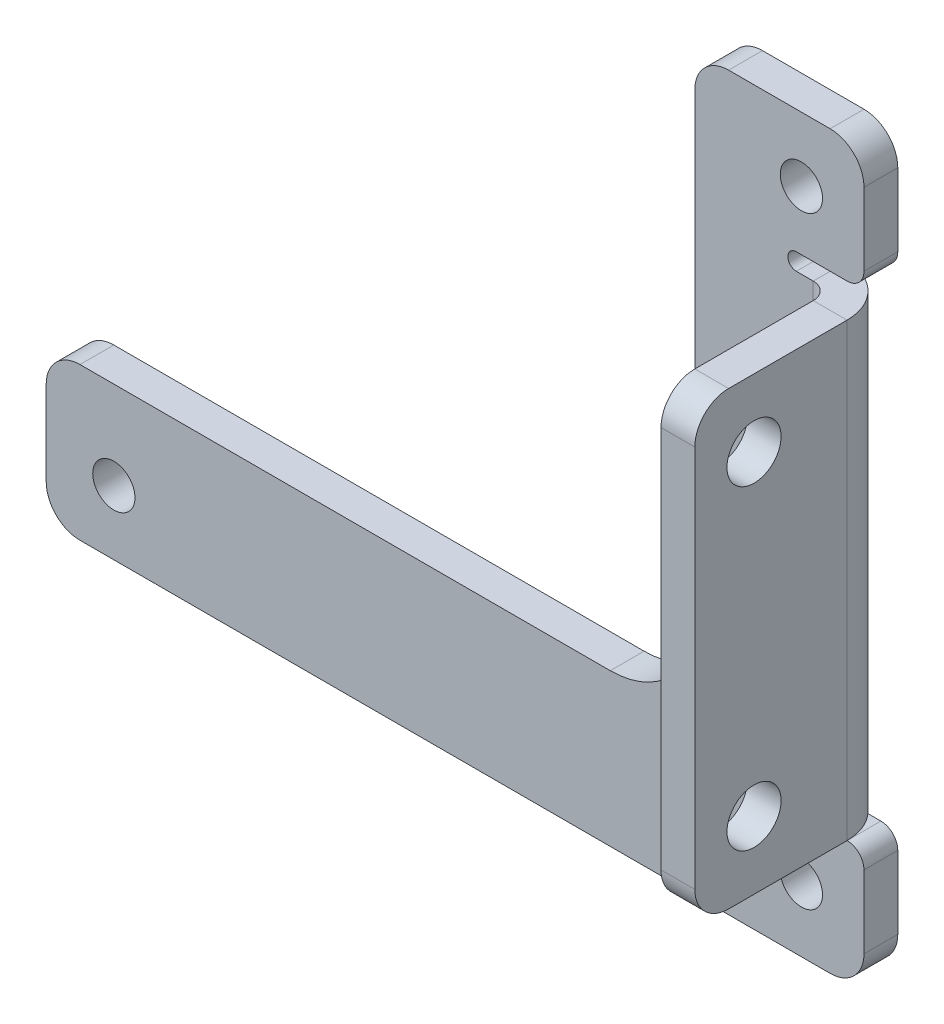
ISO-10303-21;
HEADER;
FILE_DESCRIPTION(('STEP AP214'),'2;1');
FILE_NAME('part.step','',(''),(''),'','','');
FILE_SCHEMA(('AUTOMOTIVE_DESIGN { 1 0 10303 214 1 1 1 1 }'));
ENDSEC;
DATA;
#1=APPLICATION_CONTEXT('core data for automotive mechanical design processes');
#2=APPLICATION_PROTOCOL_DEFINITION('international standard','automotive_design',2000,#1);
#3=PRODUCT_CONTEXT('',#1,'mechanical');
#4=PRODUCT('Part','Part','',(#3));
#5=PRODUCT_RELATED_PRODUCT_CATEGORY('part','',(#4));
#6=PRODUCT_DEFINITION_FORMATION('','',#4);
#7=PRODUCT_DEFINITION_CONTEXT('part definition',#1,'design');
#8=PRODUCT_DEFINITION('design','',#6,#7);
#9=PRODUCT_DEFINITION_SHAPE('','',#8);
#10=(LENGTH_UNIT() NAMED_UNIT(*) SI_UNIT(.MILLI.,.METRE.));
#11=(NAMED_UNIT(*) PLANE_ANGLE_UNIT() SI_UNIT($,.RADIAN.));
#12=(NAMED_UNIT(*) SI_UNIT($,.STERADIAN.) SOLID_ANGLE_UNIT());
#13=UNCERTAINTY_MEASURE_WITH_UNIT(LENGTH_MEASURE(1.E-05),#10,'distance_accuracy_value','');
#14=(GEOMETRIC_REPRESENTATION_CONTEXT(3) GLOBAL_UNCERTAINTY_ASSIGNED_CONTEXT((#13)) GLOBAL_UNIT_ASSIGNED_CONTEXT((#10,
#11,#12)) REPRESENTATION_CONTEXT('',''));
#15=CARTESIAN_POINT('',(0.,0.,0.));
#16=DIRECTION('',(0.,0.,1.));
#17=DIRECTION('',(1.,0.,0.));
#18=AXIS2_PLACEMENT_3D('',#15,#16,#17);
#19=CARTESIAN_POINT('',(48.35,0.,2.));
#20=DIRECTION('',(-1.,0.,0.));
#21=DIRECTION('',(0.,1.,0.));
#22=AXIS2_PLACEMENT_3D('',#19,#20,#21);
#23=PLANE('',#22);
#24=DIRECTION('',(0.,1.,0.));
#25=VECTOR('',#24,1.);
#26=CARTESIAN_POINT('',(48.35,0.,2.));
#27=LINE('',#26,#25);
#28=CARTESIAN_POINT('',(48.35,36.95,2.));
#29=VERTEX_POINT('',#28);
#30=CARTESIAN_POINT('',(48.35,41.25,2.));
#31=VERTEX_POINT('',#30);
#32=EDGE_CURVE('E357',#29,#31,#27,.T.);
#33=ORIENTED_EDGE('',*,*,#32,.F.);
#34=DIRECTION('',(0.,0.,-1.));
#35=VECTOR('',#34,1.);
#36=CARTESIAN_POINT('',(48.35,36.95,2.00000000000026));
#37=LINE('',#36,#35);
#38=CARTESIAN_POINT('',(48.35,36.95,0.));
#39=VERTEX_POINT('',#38);
#40=EDGE_CURVE('E82',#29,#39,#37,.T.);
#41=ORIENTED_EDGE('',*,*,#40,.T.);
#42=DIRECTION('',(0.,1.,0.));
#43=VECTOR('',#42,1.);
#44=CARTESIAN_POINT('',(48.35,0.,0.));
#45=LINE('',#44,#43);
#46=CARTESIAN_POINT('',(48.35,41.25,0.));
#47=VERTEX_POINT('',#46);
#48=EDGE_CURVE('E373',#39,#47,#45,.T.);
#49=ORIENTED_EDGE('',*,*,#48,.T.);
#50=DIRECTION('',(0.,0.,-1.));
#51=VECTOR('',#50,1.);
#52=CARTESIAN_POINT('',(48.35,41.25,2.));
#53=LINE('',#52,#51);
#54=EDGE_CURVE('E452',#47,#31,#53,.F.);
#55=ORIENTED_EDGE('',*,*,#54,.T.);
#56=EDGE_LOOP('',(#33,#41,#49,#55));
#57=FACE_BOUND('',#56,.T.);
#58=ADVANCED_FACE('F74',(#57),#23,.F.);
#59=CARTESIAN_POINT('',(48.35,2.00000000000001,0.));
#60=VERTEX_POINT('',#59);
#61=CARTESIAN_POINT('',(48.35,6.30000000000001,0.));
#62=VERTEX_POINT('',#61);
#63=EDGE_CURVE('E370',#60,#62,#45,.T.);
#64=ORIENTED_EDGE('',*,*,#63,.T.);
#65=DIRECTION('',(0.,0.,-1.));
#66=VECTOR('',#65,1.);
#67=CARTESIAN_POINT('',(48.35,6.3,2.00000000000004));
#68=LINE('',#67,#66);
#69=CARTESIAN_POINT('',(48.35,6.3,2.));
#70=VERTEX_POINT('',#69);
#71=EDGE_CURVE('E473',#62,#70,#68,.F.);
#72=ORIENTED_EDGE('',*,*,#71,.T.);
#73=CARTESIAN_POINT('',(48.35,2.00000000000001,2.));
#74=VERTEX_POINT('',#73);
#75=EDGE_CURVE('E358',#74,#70,#27,.T.);
#76=ORIENTED_EDGE('',*,*,#75,.F.);
#77=DIRECTION('',(0.,0.,-1.));
#78=VECTOR('',#77,1.);
#79=CARTESIAN_POINT('',(48.35,2.00000000000001,2.));
#80=LINE('',#79,#78);
#81=EDGE_CURVE('E455',#74,#60,#80,.T.);
#82=ORIENTED_EDGE('',*,*,#81,.T.);
#83=EDGE_LOOP('',(#64,#72,#76,#82));
#84=FACE_BOUND('',#83,.T.);
#85=ADVANCED_FACE('F605',(#84),#23,.F.);
#86=CARTESIAN_POINT('',(0.,0.,2.));
#87=DIRECTION('',(0.,0.,-1.));
#88=DIRECTION('',(-1.,0.,0.));
#89=AXIS2_PLACEMENT_3D('',#86,#87,#88);
#90=PLANE('',#89);
#91=CARTESIAN_POINT('',(44.65,39.45,2.));
#92=DIRECTION('',(0.,0.,-1.));
#93=DIRECTION('',(-1.,0.,0.));
#94=AXIS2_PLACEMENT_3D('',#91,#92,#93);
#95=CIRCLE('',#94,1.25);
#96=CARTESIAN_POINT('',(43.4,39.45,2.));
#97=VERTEX_POINT('',#96);
#98=EDGE_CURVE('E518',#97,#97,#95,.T.);
#99=ORIENTED_EDGE('',*,*,#98,.T.);
#100=EDGE_LOOP('',(#99));
#101=FACE_BOUND('',#100,.T.);
#102=CARTESIAN_POINT('',(3.99999999999998,3.8,2.));
#103=DIRECTION('',(0.,0.,-1.));
#104=DIRECTION('',(-1.,0.,0.));
#105=AXIS2_PLACEMENT_3D('',#102,#103,#104);
#106=CIRCLE('',#105,1.25);
#107=CARTESIAN_POINT('',(2.74999999999998,3.8,2.));
#108=VERTEX_POINT('',#107);
#109=EDGE_CURVE('E524',#108,#108,#106,.T.);
#110=ORIENTED_EDGE('',*,*,#109,.T.);
#111=EDGE_LOOP('',(#110));
#112=FACE_BOUND('',#111,.T.);
#113=CARTESIAN_POINT('',(44.65,3.8,2.));
#114=DIRECTION('',(0.,0.,-1.));
#115=DIRECTION('',(-1.,0.,0.));
#116=AXIS2_PLACEMENT_3D('',#113,#114,#115);
#117=CIRCLE('',#116,1.25);
#118=CARTESIAN_POINT('',(43.4,3.8,2.));
#119=VERTEX_POINT('',#118);
#120=EDGE_CURVE('E306',#119,#119,#117,.T.);
#121=ORIENTED_EDGE('',*,*,#120,.T.);
#122=EDGE_LOOP('',(#121));
#123=FACE_BOUND('',#122,.T.);
#124=ORIENTED_EDGE('',*,*,#75,.T.);
#125=CARTESIAN_POINT('',(47.35,6.3,2.));
#126=DIRECTION('',(0.,0.,-1.));
#127=DIRECTION('',(-1.,0.,0.));
#128=AXIS2_PLACEMENT_3D('',#125,#126,#127);
#129=CIRCLE('',#128,1.);
#130=CARTESIAN_POINT('',(47.35,7.3,2.));
#131=VERTEX_POINT('',#130);
#132=EDGE_CURVE('E476',#70,#131,#129,.F.);
#133=ORIENTED_EDGE('',*,*,#132,.T.);
#134=DIRECTION('',(1.,0.,0.));
#135=VECTOR('',#134,1.);
#136=CARTESIAN_POINT('',(44.35,7.3,2.));
#137=LINE('',#136,#135);
#138=CARTESIAN_POINT('',(44.35,7.3,2.));
#139=VERTEX_POINT('',#138);
#140=EDGE_CURVE('E339',#139,#131,#137,.T.);
#141=ORIENTED_EDGE('',*,*,#140,.F.);
#142=CARTESIAN_POINT('',(44.35,7.8,2.));
#143=DIRECTION('',(0.,0.,1.));
#144=DIRECTION('',(1.,0.,0.));
#145=AXIS2_PLACEMENT_3D('',#142,#143,#144);
#146=CIRCLE('',#145,0.5);
#147=CARTESIAN_POINT('',(44.35,8.3,2.));
#148=VERTEX_POINT('',#147);
#149=EDGE_CURVE('E335',#148,#139,#146,.T.);
#150=ORIENTED_EDGE('',*,*,#149,.F.);
#151=DIRECTION('',(-1.,0.,0.));
#152=VECTOR('',#151,1.);
#153=CARTESIAN_POINT('',(45.35,8.3,2.));
#154=LINE('',#153,#152);
#155=CARTESIAN_POINT('',(45.35,8.3,2.));
#156=VERTEX_POINT('',#155);
#157=EDGE_CURVE('E332',#156,#148,#154,.T.);
#158=ORIENTED_EDGE('',*,*,#157,.F.);
#159=DIRECTION('',(0.,1.,0.));
#160=VECTOR('',#159,1.);
#161=CARTESIAN_POINT('',(45.35,34.95,2.00000000000001));
#162=LINE('',#161,#160);
#163=CARTESIAN_POINT('',(45.35,34.95,2.00000000000001));
#164=VERTEX_POINT('',#163);
#165=EDGE_CURVE('E313',#164,#156,#162,.F.);
#166=ORIENTED_EDGE('',*,*,#165,.F.);
#167=DIRECTION('',(1.,0.,0.));
#168=VECTOR('',#167,1.);
#169=CARTESIAN_POINT('',(44.35,34.95,2.00000000000001));
#170=LINE('',#169,#168);
#171=CARTESIAN_POINT('',(44.35,34.95,2.00000000000001));
#172=VERTEX_POINT('',#171);
#173=EDGE_CURVE('E328',#172,#164,#170,.T.);
#174=ORIENTED_EDGE('',*,*,#173,.F.);
#175=CARTESIAN_POINT('',(44.35,35.45,2.00000000000001));
#176=DIRECTION('',(0.,0.,1.));
#177=DIRECTION('',(1.,0.,0.));
#178=AXIS2_PLACEMENT_3D('',#175,#176,#177);
#179=CIRCLE('',#178,0.5);
#180=CARTESIAN_POINT('',(44.35,35.95,2.00000000000001));
#181=VERTEX_POINT('',#180);
#182=EDGE_CURVE('E324',#181,#172,#179,.T.);
#183=ORIENTED_EDGE('',*,*,#182,.F.);
#184=DIRECTION('',(-1.,0.,0.));
#185=VECTOR('',#184,1.);
#186=CARTESIAN_POINT('',(48.35,35.95,2.));
#187=LINE('',#186,#185);
#188=CARTESIAN_POINT('',(47.35,35.95,2.));
#189=VERTEX_POINT('',#188);
#190=EDGE_CURVE('E321',#189,#181,#187,.T.);
#191=ORIENTED_EDGE('',*,*,#190,.F.);
#192=CARTESIAN_POINT('',(47.35,36.95,2.));
#193=DIRECTION('',(0.,0.,-1.));
#194=DIRECTION('',(-1.,0.,0.));
#195=AXIS2_PLACEMENT_3D('',#192,#193,#194);
#196=CIRCLE('',#195,1.);
#197=EDGE_CURVE('E89',#189,#29,#196,.F.);
#198=ORIENTED_EDGE('',*,*,#197,.T.);
#199=ORIENTED_EDGE('',*,*,#32,.T.);
#200=CARTESIAN_POINT('',(46.35,41.25,2.));
#201=DIRECTION('',(0.,0.,-1.));
#202=DIRECTION('',(-1.,0.,0.));
#203=AXIS2_PLACEMENT_3D('',#200,#201,#202);
#204=CIRCLE('',#203,2.);
#205=CARTESIAN_POINT('',(46.35,43.25,2.));
#206=VERTEX_POINT('',#205);
#207=EDGE_CURVE('E416',#31,#206,#204,.F.);
#208=ORIENTED_EDGE('',*,*,#207,.T.);
#209=DIRECTION('',(-1.,0.,0.));
#210=VECTOR('',#209,1.);
#211=CARTESIAN_POINT('',(0.,43.25,2.));
#212=LINE('',#211,#210);
#213=CARTESIAN_POINT('',(40.35,43.25,2.));
#214=VERTEX_POINT('',#213);
#215=EDGE_CURVE('E361',#206,#214,#212,.T.);
#216=ORIENTED_EDGE('',*,*,#215,.T.);
#217=CARTESIAN_POINT('',(40.35,41.25,2.));
#218=DIRECTION('',(0.,0.,-1.));
#219=DIRECTION('',(-1.,0.,0.));
#220=AXIS2_PLACEMENT_3D('',#217,#218,#219);
#221=CIRCLE('',#220,2.);
#222=CARTESIAN_POINT('',(38.35,41.25,2.));
#223=VERTEX_POINT('',#222);
#224=EDGE_CURVE('E422',#214,#223,#221,.F.);
#225=ORIENTED_EDGE('',*,*,#224,.T.);
#226=DIRECTION('',(0.,1.,0.));
#227=VECTOR('',#226,1.);
#228=CARTESIAN_POINT('',(38.35,9.,2.));
#229=LINE('',#228,#227);
#230=CARTESIAN_POINT('',(38.35,14.,2.));
#231=VERTEX_POINT('',#230);
#232=EDGE_CURVE('E502',#231,#223,#229,.T.);
#233=ORIENTED_EDGE('',*,*,#232,.F.);
#234=CARTESIAN_POINT('',(33.35,14.,2.));
#235=DIRECTION('',(0.,0.,-1.));
#236=DIRECTION('',(-1.,0.,0.));
#237=AXIS2_PLACEMENT_3D('',#234,#235,#236);
#238=CIRCLE('',#237,5.);
#239=CARTESIAN_POINT('',(33.35,9.,2.));
#240=VERTEX_POINT('',#239);
#241=EDGE_CURVE('E462',#231,#240,#238,.T.);
#242=ORIENTED_EDGE('',*,*,#241,.T.);
#243=DIRECTION('',(1.,0.,0.));
#244=VECTOR('',#243,1.);
#245=CARTESIAN_POINT('',(0.,9.,2.));
#246=LINE('',#245,#244);
#247=CARTESIAN_POINT('',(2.,9.,2.));
#248=VERTEX_POINT('',#247);
#249=EDGE_CURVE('E507',#248,#240,#246,.T.);
#250=ORIENTED_EDGE('',*,*,#249,.F.);
#251=CARTESIAN_POINT('',(2.,7.,2.));
#252=DIRECTION('',(0.,0.,-1.));
#253=DIRECTION('',(-1.,0.,0.));
#254=AXIS2_PLACEMENT_3D('',#251,#252,#253);
#255=CIRCLE('',#254,2.);
#256=CARTESIAN_POINT('',(0.,7.,2.));
#257=VERTEX_POINT('',#256);
#258=EDGE_CURVE('E420',#248,#257,#255,.F.);
#259=ORIENTED_EDGE('',*,*,#258,.T.);
#260=DIRECTION('',(0.,-1.,0.));
#261=VECTOR('',#260,1.);
#262=CARTESIAN_POINT('',(0.,0.,2.));
#263=LINE('',#262,#261);
#264=CARTESIAN_POINT('',(0.,2.,2.));
#265=VERTEX_POINT('',#264);
#266=EDGE_CURVE('E350',#257,#265,#263,.T.);
#267=ORIENTED_EDGE('',*,*,#266,.T.);
#268=CARTESIAN_POINT('',(2.,2.,2.));
#269=DIRECTION('',(0.,0.,-1.));
#270=DIRECTION('',(-1.,0.,0.));
#271=AXIS2_PLACEMENT_3D('',#268,#269,#270);
#272=CIRCLE('',#271,2.);
#273=CARTESIAN_POINT('',(2.,0.,2.));
#274=VERTEX_POINT('',#273);
#275=EDGE_CURVE('E418',#265,#274,#272,.F.);
#276=ORIENTED_EDGE('',*,*,#275,.T.);
#277=DIRECTION('',(1.,0.,0.));
#278=VECTOR('',#277,1.);
#279=CARTESIAN_POINT('',(0.,0.,2.));
#280=LINE('',#279,#278);
#281=CARTESIAN_POINT('',(46.35,0.,2.));
#282=VERTEX_POINT('',#281);
#283=EDGE_CURVE('E353',#274,#282,#280,.T.);
#284=ORIENTED_EDGE('',*,*,#283,.T.);
#285=CARTESIAN_POINT('',(46.35,2.00000000000001,2.));
#286=DIRECTION('',(0.,0.,-1.));
#287=DIRECTION('',(-1.,0.,0.));
#288=AXIS2_PLACEMENT_3D('',#285,#286,#287);
#289=CIRCLE('',#288,2.);
#290=EDGE_CURVE('E414',#282,#74,#289,.F.);
#291=ORIENTED_EDGE('',*,*,#290,.T.);
#292=EDGE_LOOP('',(#124,#133,#141,#150,#158,#166,#174,#183,#191,#198,#199,#208,#216,#225,#233,
#242,#250,#259,#267,#276,#284,#291));
#293=FACE_BOUND('',#292,.T.);
#294=ADVANCED_FACE('F493',(#101,#112,#123,#293),#90,.F.);
#295=CARTESIAN_POINT('',(0.,0.,0.));
#296=DIRECTION('',(0.,0.,-1.));
#297=DIRECTION('',(-1.,0.,0.));
#298=AXIS2_PLACEMENT_3D('',#295,#296,#297);
#299=PLANE('',#298);
#300=DIRECTION('',(1.,0.,0.));
#301=VECTOR('',#300,1.);
#302=CARTESIAN_POINT('',(0.,7.30000000000003,0.));
#303=LINE('',#302,#301);
#304=CARTESIAN_POINT('',(44.35,7.30000000000001,0.));
#305=VERTEX_POINT('',#304);
#306=CARTESIAN_POINT('',(47.35,7.30000000000001,0.));
#307=VERTEX_POINT('',#306);
#308=EDGE_CURVE('E364',#305,#307,#303,.T.);
#309=ORIENTED_EDGE('',*,*,#308,.T.);
#310=CARTESIAN_POINT('',(47.35,6.30000000000001,0.));
#311=DIRECTION('',(0.,0.,-1.));
#312=DIRECTION('',(-1.,0.,0.));
#313=AXIS2_PLACEMENT_3D('',#310,#311,#312);
#314=CIRCLE('',#313,1.);
#315=EDGE_CURVE('E471',#307,#62,#314,.T.);
#316=ORIENTED_EDGE('',*,*,#315,.T.);
#317=ORIENTED_EDGE('',*,*,#63,.F.);
#318=CARTESIAN_POINT('',(46.35,2.00000000000001,0.));
#319=DIRECTION('',(0.,0.,-1.));
#320=DIRECTION('',(-1.,0.,0.));
#321=AXIS2_PLACEMENT_3D('',#318,#319,#320);
#322=CIRCLE('',#321,2.);
#323=CARTESIAN_POINT('',(46.35,0.,0.));
#324=VERTEX_POINT('',#323);
#325=EDGE_CURVE('E428',#60,#324,#322,.T.);
#326=ORIENTED_EDGE('',*,*,#325,.T.);
#327=DIRECTION('',(-1.,0.,0.));
#328=VECTOR('',#327,1.);
#329=CARTESIAN_POINT('',(0.,0.,0.));
#330=LINE('',#329,#328);
#331=CARTESIAN_POINT('',(2.,0.,0.));
#332=VERTEX_POINT('',#331);
#333=EDGE_CURVE('E367',#332,#324,#330,.F.);
#334=ORIENTED_EDGE('',*,*,#333,.F.);
#335=CARTESIAN_POINT('',(2.,2.,0.));
#336=DIRECTION('',(0.,0.,-1.));
#337=DIRECTION('',(-1.,0.,0.));
#338=AXIS2_PLACEMENT_3D('',#335,#336,#337);
#339=CIRCLE('',#338,2.);
#340=CARTESIAN_POINT('',(0.,2.,0.));
#341=VERTEX_POINT('',#340);
#342=EDGE_CURVE('E433',#332,#341,#339,.T.);
#343=ORIENTED_EDGE('',*,*,#342,.T.);
#344=DIRECTION('',(0.,1.,0.));
#345=VECTOR('',#344,1.);
#346=CARTESIAN_POINT('',(0.,0.,0.));
#347=LINE('',#346,#345);
#348=CARTESIAN_POINT('',(0.,7.,0.));
#349=VERTEX_POINT('',#348);
#350=EDGE_CURVE('E323',#349,#341,#347,.F.);
#351=ORIENTED_EDGE('',*,*,#350,.F.);
#352=CARTESIAN_POINT('',(2.,7.,0.));
#353=DIRECTION('',(0.,0.,-1.));
#354=DIRECTION('',(-1.,0.,0.));
#355=AXIS2_PLACEMENT_3D('',#352,#353,#354);
#356=CIRCLE('',#355,2.);
#357=CARTESIAN_POINT('',(2.,9.,0.));
#358=VERTEX_POINT('',#357);
#359=EDGE_CURVE('E435',#349,#358,#356,.T.);
#360=ORIENTED_EDGE('',*,*,#359,.T.);
#361=DIRECTION('',(1.,0.,0.));
#362=VECTOR('',#361,1.);
#363=CARTESIAN_POINT('',(0.,9.,0.));
#364=LINE('',#363,#362);
#365=CARTESIAN_POINT('',(33.35,9.,0.));
#366=VERTEX_POINT('',#365);
#367=EDGE_CURVE('E506',#358,#366,#364,.T.);
#368=ORIENTED_EDGE('',*,*,#367,.T.);
#369=CARTESIAN_POINT('',(33.35,14.,0.));
#370=DIRECTION('',(0.,0.,-1.));
#371=DIRECTION('',(-1.,0.,0.));
#372=AXIS2_PLACEMENT_3D('',#369,#370,#371);
#373=CIRCLE('',#372,5.);
#374=CARTESIAN_POINT('',(38.35,14.,0.));
#375=VERTEX_POINT('',#374);
#376=EDGE_CURVE('E464',#366,#375,#373,.F.);
#377=ORIENTED_EDGE('',*,*,#376,.T.);
#378=DIRECTION('',(0.,1.,0.));
#379=VECTOR('',#378,1.);
#380=CARTESIAN_POINT('',(38.35,9.,0.));
#381=LINE('',#380,#379);
#382=CARTESIAN_POINT('',(38.35,41.25,0.));
#383=VERTEX_POINT('',#382);
#384=EDGE_CURVE('E510',#375,#383,#381,.T.);
#385=ORIENTED_EDGE('',*,*,#384,.T.);
#386=CARTESIAN_POINT('',(40.35,41.25,0.));
#387=DIRECTION('',(0.,0.,-1.));
#388=DIRECTION('',(-1.,0.,0.));
#389=AXIS2_PLACEMENT_3D('',#386,#387,#388);
#390=CIRCLE('',#389,2.);
#391=CARTESIAN_POINT('',(40.35,43.25,0.));
#392=VERTEX_POINT('',#391);
#393=EDGE_CURVE('E437',#383,#392,#390,.T.);
#394=ORIENTED_EDGE('',*,*,#393,.T.);
#395=DIRECTION('',(-1.,0.,0.));
#396=VECTOR('',#395,1.);
#397=CARTESIAN_POINT('',(0.,43.25,0.));
#398=LINE('',#397,#396);
#399=CARTESIAN_POINT('',(46.35,43.25,0.));
#400=VERTEX_POINT('',#399);
#401=EDGE_CURVE('E354',#400,#392,#398,.T.);
#402=ORIENTED_EDGE('',*,*,#401,.F.);
#403=CARTESIAN_POINT('',(46.35,41.25,0.));
#404=DIRECTION('',(0.,0.,-1.));
#405=DIRECTION('',(-1.,0.,0.));
#406=AXIS2_PLACEMENT_3D('',#403,#404,#405);
#407=CIRCLE('',#406,2.);
#408=EDGE_CURVE('E430',#400,#47,#407,.T.);
#409=ORIENTED_EDGE('',*,*,#408,.T.);
#410=ORIENTED_EDGE('',*,*,#48,.F.);
#411=CARTESIAN_POINT('',(47.35,36.95,0.));
#412=DIRECTION('',(0.,0.,-1.));
#413=DIRECTION('',(-1.,0.,0.));
#414=AXIS2_PLACEMENT_3D('',#411,#412,#413);
#415=CIRCLE('',#414,1.);
#416=CARTESIAN_POINT('',(47.35,35.95,0.));
#417=VERTEX_POINT('',#416);
#418=EDGE_CURVE('E469',#39,#417,#415,.T.);
#419=ORIENTED_EDGE('',*,*,#418,.T.);
#420=DIRECTION('',(-1.,0.,0.));
#421=VECTOR('',#420,1.);
#422=CARTESIAN_POINT('',(0.,35.95,0.));
#423=LINE('',#422,#421);
#424=CARTESIAN_POINT('',(44.35,35.95,0.));
#425=VERTEX_POINT('',#424);
#426=EDGE_CURVE('E390',#417,#425,#423,.T.);
#427=ORIENTED_EDGE('',*,*,#426,.T.);
#428=CARTESIAN_POINT('',(44.35,35.45,0.));
#429=DIRECTION('',(0.,0.,-1.));
#430=DIRECTION('',(-1.,0.,0.));
#431=AXIS2_PLACEMENT_3D('',#428,#429,#430);
#432=CIRCLE('',#431,0.5);
#433=CARTESIAN_POINT('',(44.35,34.95,0.));
#434=VERTEX_POINT('',#433);
#435=EDGE_CURVE('E387',#425,#434,#432,.F.);
#436=ORIENTED_EDGE('',*,*,#435,.T.);
#437=DIRECTION('',(1.,0.,0.));
#438=VECTOR('',#437,1.);
#439=CARTESIAN_POINT('',(0.,34.95,0.));
#440=LINE('',#439,#438);
#441=CARTESIAN_POINT('',(45.35,34.95,0.));
#442=VERTEX_POINT('',#441);
#443=EDGE_CURVE('E384',#434,#442,#440,.T.);
#444=ORIENTED_EDGE('',*,*,#443,.T.);
#445=DIRECTION('',(0.,1.,0.));
#446=VECTOR('',#445,1.);
#447=CARTESIAN_POINT('',(45.35,34.95,0.));
#448=LINE('',#447,#446);
#449=CARTESIAN_POINT('',(45.35,8.30000000000001,0.));
#450=VERTEX_POINT('',#449);
#451=EDGE_CURVE('E265',#442,#450,#448,.F.);
#452=ORIENTED_EDGE('',*,*,#451,.T.);
#453=DIRECTION('',(-1.,0.,0.));
#454=VECTOR('',#453,1.);
#455=CARTESIAN_POINT('',(0.,8.30000000000001,0.));
#456=LINE('',#455,#454);
#457=CARTESIAN_POINT('',(44.35,8.30000000000001,0.));
#458=VERTEX_POINT('',#457);
#459=EDGE_CURVE('E381',#450,#458,#456,.T.);
#460=ORIENTED_EDGE('',*,*,#459,.T.);
#461=CARTESIAN_POINT('',(44.35,7.80000000000001,0.));
#462=DIRECTION('',(0.,0.,-1.));
#463=DIRECTION('',(-1.,0.,0.));
#464=AXIS2_PLACEMENT_3D('',#461,#462,#463);
#465=CIRCLE('',#464,0.5);
#466=EDGE_CURVE('E378',#458,#305,#465,.F.);
#467=ORIENTED_EDGE('',*,*,#466,.T.);
#468=EDGE_LOOP('',(#309,#316,#317,#326,#334,#343,#351,#360,#368,#377,#385,#394,#402,#409,#410,
#419,#427,#436,#444,#452,#460,#467));
#469=FACE_BOUND('',#468,.T.);
#470=CARTESIAN_POINT('',(44.65,39.45,0.));
#471=DIRECTION('',(0.,0.,-1.));
#472=DIRECTION('',(-1.,0.,0.));
#473=AXIS2_PLACEMENT_3D('',#470,#471,#472);
#474=CIRCLE('',#473,1.25);
#475=CARTESIAN_POINT('',(43.4,39.45,0.));
#476=VERTEX_POINT('',#475);
#477=EDGE_CURVE('E515',#476,#476,#474,.T.);
#478=ORIENTED_EDGE('',*,*,#477,.F.);
#479=EDGE_LOOP('',(#478));
#480=FACE_BOUND('',#479,.T.);
#481=CARTESIAN_POINT('',(3.99999999999998,3.8,0.));
#482=DIRECTION('',(0.,0.,-1.));
#483=DIRECTION('',(-1.,0.,0.));
#484=AXIS2_PLACEMENT_3D('',#481,#482,#483);
#485=CIRCLE('',#484,1.25);
#486=CARTESIAN_POINT('',(2.74999999999998,3.8,0.));
#487=VERTEX_POINT('',#486);
#488=EDGE_CURVE('E521',#487,#487,#485,.T.);
#489=ORIENTED_EDGE('',*,*,#488,.F.);
#490=EDGE_LOOP('',(#489));
#491=FACE_BOUND('',#490,.T.);
#492=CARTESIAN_POINT('',(44.65,3.8,0.));
#493=DIRECTION('',(0.,0.,-1.));
#494=DIRECTION('',(-1.,0.,0.));
#495=AXIS2_PLACEMENT_3D('',#492,#493,#494);
#496=CIRCLE('',#495,1.25);
#497=CARTESIAN_POINT('',(43.4,3.8,0.));
#498=VERTEX_POINT('',#497);
#499=EDGE_CURVE('E527',#498,#498,#496,.T.);
#500=ORIENTED_EDGE('',*,*,#499,.F.);
#501=EDGE_LOOP('',(#500));
#502=FACE_BOUND('',#501,.T.);
#503=ADVANCED_FACE('F483',(#469,#480,#491,#502),#299,.T.);
#504=CARTESIAN_POINT('',(0.,43.25,2.));
#505=DIRECTION('',(0.,-1.,0.));
#506=DIRECTION('',(-1.,0.,0.));
#507=AXIS2_PLACEMENT_3D('',#504,#505,#506);
#508=PLANE('',#507);
#509=ORIENTED_EDGE('',*,*,#401,.T.);
#510=DIRECTION('',(0.,0.,1.));
#511=VECTOR('',#510,1.);
#512=CARTESIAN_POINT('',(40.35,43.25,2.));
#513=LINE('',#512,#511);
#514=EDGE_CURVE('E411',#392,#214,#513,.T.);
#515=ORIENTED_EDGE('',*,*,#514,.T.);
#516=ORIENTED_EDGE('',*,*,#215,.F.);
#517=DIRECTION('',(0.,0.,-1.));
#518=VECTOR('',#517,1.);
#519=CARTESIAN_POINT('',(46.35,43.25,2.));
#520=LINE('',#519,#518);
#521=EDGE_CURVE('E409',#206,#400,#520,.T.);
#522=ORIENTED_EDGE('',*,*,#521,.T.);
#523=EDGE_LOOP('',(#509,#515,#516,#522));
#524=FACE_BOUND('',#523,.T.);
#525=ADVANCED_FACE('F495',(#524),#508,.F.);
#526=CARTESIAN_POINT('',(0.,0.,2.));
#527=DIRECTION('',(1.,0.,0.));
#528=DIRECTION('',(0.,-1.,0.));
#529=AXIS2_PLACEMENT_3D('',#526,#527,#528);
#530=PLANE('',#529);
#531=ORIENTED_EDGE('',*,*,#266,.F.);
#532=DIRECTION('',(0.,0.,1.));
#533=VECTOR('',#532,1.);
#534=CARTESIAN_POINT('',(0.,7.,0.));
#535=LINE('',#534,#533);
#536=EDGE_CURVE('E445',#257,#349,#535,.F.);
#537=ORIENTED_EDGE('',*,*,#536,.T.);
#538=ORIENTED_EDGE('',*,*,#350,.T.);
#539=DIRECTION('',(0.,0.,-1.));
#540=VECTOR('',#539,1.);
#541=CARTESIAN_POINT('',(0.,2.,2.));
#542=LINE('',#541,#540);
#543=EDGE_CURVE('E442',#341,#265,#542,.F.);
#544=ORIENTED_EDGE('',*,*,#543,.T.);
#545=EDGE_LOOP('',(#531,#537,#538,#544));
#546=FACE_BOUND('',#545,.T.);
#547=ADVANCED_FACE('F618',(#546),#530,.F.);
#548=CARTESIAN_POINT('',(0.,0.,2.));
#549=DIRECTION('',(0.,1.,0.));
#550=DIRECTION('',(1.,0.,0.));
#551=AXIS2_PLACEMENT_3D('',#548,#549,#550);
#552=PLANE('',#551);
#553=ORIENTED_EDGE('',*,*,#283,.F.);
#554=DIRECTION('',(0.,0.,-1.));
#555=VECTOR('',#554,1.);
#556=CARTESIAN_POINT('',(2.,0.,2.));
#557=LINE('',#556,#555);
#558=EDGE_CURVE('E450',#274,#332,#557,.T.);
#559=ORIENTED_EDGE('',*,*,#558,.T.);
#560=ORIENTED_EDGE('',*,*,#333,.T.);
#561=DIRECTION('',(0.,0.,-1.));
#562=VECTOR('',#561,1.);
#563=CARTESIAN_POINT('',(46.35,0.,2.));
#564=LINE('',#563,#562);
#565=EDGE_CURVE('E447',#324,#282,#564,.F.);
#566=ORIENTED_EDGE('',*,*,#565,.T.);
#567=EDGE_LOOP('',(#553,#559,#560,#566));
#568=FACE_BOUND('',#567,.T.);
#569=ADVANCED_FACE('F614',(#568),#552,.F.);
#570=CARTESIAN_POINT('',(48.35,35.95,2.));
#571=DIRECTION('',(0.,-1.,0.));
#572=DIRECTION('',(0.,0.,-1.));
#573=AXIS2_PLACEMENT_3D('',#570,#571,#572);
#574=PLANE('',#573);
#575=ORIENTED_EDGE('',*,*,#426,.F.);
#576=DIRECTION('',(0.,0.,1.));
#577=VECTOR('',#576,1.);
#578=CARTESIAN_POINT('',(47.35,35.95,2.));
#579=LINE('',#578,#577);
#580=EDGE_CURVE('E15',#417,#189,#579,.T.);
#581=ORIENTED_EDGE('',*,*,#580,.T.);
#582=ORIENTED_EDGE('',*,*,#190,.T.);
#583=DIRECTION('',(0.,0.,-1.));
#584=VECTOR('',#583,1.);
#585=CARTESIAN_POINT('',(44.35,35.95,2.00000000000001));
#586=LINE('',#585,#584);
#587=EDGE_CURVE('E327',#181,#425,#586,.T.);
#588=ORIENTED_EDGE('',*,*,#587,.T.);
#589=EDGE_LOOP('',(#575,#581,#582,#588));
#590=FACE_BOUND('',#589,.T.);
#591=ADVANCED_FACE('F617',(#590),#574,.T.);
#592=CARTESIAN_POINT('',(44.35,35.45,2.00000000000001));
#593=DIRECTION('',(0.,0.,-1.));
#594=DIRECTION('',(0.,1.,0.));
#595=AXIS2_PLACEMENT_3D('',#592,#593,#594);
#596=CYLINDRICAL_SURFACE('',#595,0.5);
#597=ORIENTED_EDGE('',*,*,#435,.F.);
#598=ORIENTED_EDGE('',*,*,#587,.F.);
#599=ORIENTED_EDGE('',*,*,#182,.T.);
#600=DIRECTION('',(0.,0.,-1.));
#601=VECTOR('',#600,1.);
#602=CARTESIAN_POINT('',(44.35,34.95,2.00000000000001));
#603=LINE('',#602,#601);
#604=EDGE_CURVE('E331',#172,#434,#603,.T.);
#605=ORIENTED_EDGE('',*,*,#604,.T.);
#606=EDGE_LOOP('',(#597,#598,#599,#605));
#607=FACE_BOUND('',#606,.T.);
#608=ADVANCED_FACE('F595',(#607),#596,.F.);
#609=CARTESIAN_POINT('',(44.35,34.95,2.00000000000001));
#610=DIRECTION('',(0.,1.,0.));
#611=DIRECTION('',(0.,0.,1.));
#612=AXIS2_PLACEMENT_3D('',#609,#610,#611);
#613=PLANE('',#612);
#614=ORIENTED_EDGE('',*,*,#443,.F.);
#615=ORIENTED_EDGE('',*,*,#604,.F.);
#616=ORIENTED_EDGE('',*,*,#173,.T.);
#617=DIRECTION('',(0.,0.,-1.));
#618=VECTOR('',#617,1.);
#619=CARTESIAN_POINT('',(45.35,34.95,2.00000000000001));
#620=LINE('',#619,#618);
#621=EDGE_CURVE('E309',#164,#442,#620,.T.);
#622=ORIENTED_EDGE('',*,*,#621,.T.);
#623=EDGE_LOOP('',(#614,#615,#616,#622));
#624=FACE_BOUND('',#623,.T.);
#625=ADVANCED_FACE('F593',(#624),#613,.T.);
#626=CARTESIAN_POINT('',(45.35,8.3,2.));
#627=DIRECTION('',(0.,-1.,0.));
#628=DIRECTION('',(0.,0.,-1.));
#629=AXIS2_PLACEMENT_3D('',#626,#627,#628);
#630=PLANE('',#629);
#631=ORIENTED_EDGE('',*,*,#459,.F.);
#632=DIRECTION('',(0.,0.,-1.));
#633=VECTOR('',#632,1.);
#634=CARTESIAN_POINT('',(45.35,8.3,2.));
#635=LINE('',#634,#633);
#636=EDGE_CURVE('E316',#156,#450,#635,.T.);
#637=ORIENTED_EDGE('',*,*,#636,.F.);
#638=ORIENTED_EDGE('',*,*,#157,.T.);
#639=DIRECTION('',(0.,0.,-1.));
#640=VECTOR('',#639,1.);
#641=CARTESIAN_POINT('',(44.35,8.3,2.));
#642=LINE('',#641,#640);
#643=EDGE_CURVE('E338',#148,#458,#642,.T.);
#644=ORIENTED_EDGE('',*,*,#643,.T.);
#645=EDGE_LOOP('',(#631,#637,#638,#644));
#646=FACE_BOUND('',#645,.T.);
#647=ADVANCED_FACE('F590',(#646),#630,.T.);
#648=CARTESIAN_POINT('',(44.35,7.8,2.));
#649=DIRECTION('',(0.,0.,-1.));
#650=DIRECTION('',(0.,1.,0.));
#651=AXIS2_PLACEMENT_3D('',#648,#649,#650);
#652=CYLINDRICAL_SURFACE('',#651,0.5);
#653=ORIENTED_EDGE('',*,*,#466,.F.);
#654=ORIENTED_EDGE('',*,*,#643,.F.);
#655=ORIENTED_EDGE('',*,*,#149,.T.);
#656=DIRECTION('',(0.,0.,-1.));
#657=VECTOR('',#656,1.);
#658=CARTESIAN_POINT('',(44.35,7.3,2.));
#659=LINE('',#658,#657);
#660=EDGE_CURVE('E319',#139,#305,#659,.T.);
#661=ORIENTED_EDGE('',*,*,#660,.T.);
#662=EDGE_LOOP('',(#653,#654,#655,#661));
#663=FACE_BOUND('',#662,.T.);
#664=ADVANCED_FACE('F695',(#663),#652,.F.);
#665=CARTESIAN_POINT('',(44.35,7.3,2.));
#666=DIRECTION('',(0.,1.,0.));
#667=DIRECTION('',(0.,0.,1.));
#668=AXIS2_PLACEMENT_3D('',#665,#666,#667);
#669=PLANE('',#668);
#670=ORIENTED_EDGE('',*,*,#140,.T.);
#671=DIRECTION('',(0.,0.,1.));
#672=VECTOR('',#671,1.);
#673=CARTESIAN_POINT('',(47.35,7.3,2.));
#674=LINE('',#673,#672);
#675=EDGE_CURVE('E466',#131,#307,#674,.F.);
#676=ORIENTED_EDGE('',*,*,#675,.T.);
#677=ORIENTED_EDGE('',*,*,#308,.F.);
#678=ORIENTED_EDGE('',*,*,#660,.F.);
#679=EDGE_LOOP('',(#670,#676,#677,#678));
#680=FACE_BOUND('',#679,.T.);
#681=ADVANCED_FACE('F690',(#680),#669,.T.);
#682=CARTESIAN_POINT('',(45.35,8.3,3.));
#683=DIRECTION('',(0.,-1.,0.));
#684=DIRECTION('',(0.,0.,-1.));
#685=AXIS2_PLACEMENT_3D('',#682,#683,#684);
#686=PLANE('',#685);
#687=DIRECTION('',(-1.,0.,0.));
#688=VECTOR('',#687,1.);
#689=CARTESIAN_POINT('',(48.35,8.3,2.99999999999999));
#690=LINE('',#689,#688);
#691=CARTESIAN_POINT('',(46.35,8.3,2.99999999999999));
#692=VERTEX_POINT('',#691);
#693=CARTESIAN_POINT('',(48.35,8.3,2.99999999999999));
#694=VERTEX_POINT('',#693);
#695=EDGE_CURVE('E303',#692,#694,#690,.F.);
#696=ORIENTED_EDGE('',*,*,#695,.F.);
#697=CARTESIAN_POINT('',(45.35,8.3,3.));
#698=DIRECTION('',(0.,1.,0.));
#699=DIRECTION('',(0.,0.,1.));
#700=AXIS2_PLACEMENT_3D('',#697,#698,#699);
#701=CIRCLE('',#700,1.);
#702=EDGE_CURVE('E268',#156,#692,#701,.F.);
#703=ORIENTED_EDGE('',*,*,#702,.F.);
#704=ORIENTED_EDGE('',*,*,#636,.T.);
#705=CARTESIAN_POINT('',(45.35,8.3,3.));
#706=DIRECTION('',(0.,1.,0.));
#707=DIRECTION('',(0.,0.,1.));
#708=AXIS2_PLACEMENT_3D('',#705,#706,#707);
#709=CIRCLE('',#708,3.);
#710=EDGE_CURVE('E308',#450,#694,#709,.F.);
#711=ORIENTED_EDGE('',*,*,#710,.T.);
#712=EDGE_LOOP('',(#696,#703,#704,#711));
#713=FACE_BOUND('',#712,.T.);
#714=ADVANCED_FACE('F579',(#713),#686,.T.);
#715=CARTESIAN_POINT('',(45.35,34.95,3.00000000000001));
#716=DIRECTION('',(0.,-1.,0.));
#717=DIRECTION('',(0.,0.,-1.));
#718=AXIS2_PLACEMENT_3D('',#715,#716,#717);
#719=PLANE('',#718);
#720=CARTESIAN_POINT('',(45.35,34.95,3.00000000000001));
#721=DIRECTION('',(0.,1.,0.));
#722=DIRECTION('',(0.,0.,1.));
#723=AXIS2_PLACEMENT_3D('',#720,#721,#722);
#724=CIRCLE('',#723,1.);
#725=CARTESIAN_POINT('',(46.35,34.95,3.));
#726=VERTEX_POINT('',#725);
#727=EDGE_CURVE('E276',#726,#164,#724,.T.);
#728=ORIENTED_EDGE('',*,*,#727,.F.);
#729=DIRECTION('',(-1.,0.,0.));
#730=VECTOR('',#729,1.);
#731=CARTESIAN_POINT('',(46.35,34.95,3.));
#732=LINE('',#731,#730);
#733=CARTESIAN_POINT('',(48.35,34.95,3.));
#734=VERTEX_POINT('',#733);
#735=EDGE_CURVE('E272',#726,#734,#732,.F.);
#736=ORIENTED_EDGE('',*,*,#735,.T.);
#737=CARTESIAN_POINT('',(45.35,34.95,3.00000000000001));
#738=DIRECTION('',(0.,1.,0.));
#739=DIRECTION('',(0.,0.,1.));
#740=AXIS2_PLACEMENT_3D('',#737,#738,#739);
#741=CIRCLE('',#740,3.);
#742=EDGE_CURVE('E258',#734,#442,#741,.T.);
#743=ORIENTED_EDGE('',*,*,#742,.T.);
#744=ORIENTED_EDGE('',*,*,#621,.F.);
#745=EDGE_LOOP('',(#728,#736,#743,#744));
#746=FACE_BOUND('',#745,.T.);
#747=ADVANCED_FACE('F274',(#746),#719,.F.);
#748=CARTESIAN_POINT('',(45.35,34.95,3.00000000000001));
#749=DIRECTION('',(0.,1.,0.));
#750=DIRECTION('',(1.,0.,0.));
#751=AXIS2_PLACEMENT_3D('',#748,#749,#750);
#752=CYLINDRICAL_SURFACE('',#751,3.);
#753=ORIENTED_EDGE('',*,*,#451,.F.);
#754=ORIENTED_EDGE('',*,*,#742,.F.);
#755=DIRECTION('',(0.,1.,0.));
#756=VECTOR('',#755,1.);
#757=CARTESIAN_POINT('',(48.35,8.3,2.99999999999999));
#758=LINE('',#757,#756);
#759=EDGE_CURVE('E262',#734,#694,#758,.F.);
#760=ORIENTED_EDGE('',*,*,#759,.T.);
#761=ORIENTED_EDGE('',*,*,#710,.F.);
#762=EDGE_LOOP('',(#753,#754,#760,#761));
#763=FACE_BOUND('',#762,.T.);
#764=ADVANCED_FACE('F260',(#763),#752,.T.);
#765=CARTESIAN_POINT('',(45.35,34.95,3.00000000000001));
#766=DIRECTION('',(0.,1.,0.));
#767=DIRECTION('',(1.,0.,0.));
#768=AXIS2_PLACEMENT_3D('',#765,#766,#767);
#769=CYLINDRICAL_SURFACE('',#768,1.);
#770=ORIENTED_EDGE('',*,*,#165,.T.);
#771=ORIENTED_EDGE('',*,*,#702,.T.);
#772=DIRECTION('',(0.,1.,0.));
#773=VECTOR('',#772,1.);
#774=CARTESIAN_POINT('',(46.35,8.3,3.));
#775=LINE('',#774,#773);
#776=EDGE_CURVE('E280',#692,#726,#775,.T.);
#777=ORIENTED_EDGE('',*,*,#776,.T.);
#778=ORIENTED_EDGE('',*,*,#727,.T.);
#779=EDGE_LOOP('',(#770,#771,#777,#778));
#780=FACE_BOUND('',#779,.T.);
#781=ADVANCED_FACE('F555',(#780),#769,.F.);
#782=CARTESIAN_POINT('',(48.35,0.,-1.74730722804643E-13));
#783=DIRECTION('',(-1.,0.,0.));
#784=DIRECTION('',(0.,0.,1.));
#785=AXIS2_PLACEMENT_3D('',#782,#783,#784);
#786=PLANE('',#785);
#787=CARTESIAN_POINT('',(48.35,30.95,8.49999999999999));
#788=DIRECTION('',(-1.,0.,0.));
#789=DIRECTION('',(0.,0.,1.));
#790=AXIS2_PLACEMENT_3D('',#787,#788,#789);
#791=CIRCLE('',#790,1.60000000000001);
#792=CARTESIAN_POINT('',(48.35,30.95,10.1));
#793=VERTEX_POINT('',#792);
#794=EDGE_CURVE('E298',#793,#793,#791,.F.);
#795=ORIENTED_EDGE('',*,*,#794,.F.);
#796=EDGE_LOOP('',(#795));
#797=FACE_BOUND('',#796,.T.);
#798=CARTESIAN_POINT('',(48.35,12.3,8.49999999999999));
#799=DIRECTION('',(-1.,0.,0.));
#800=DIRECTION('',(0.,0.,1.));
#801=AXIS2_PLACEMENT_3D('',#798,#799,#800);
#802=CIRCLE('',#801,1.6);
#803=CARTESIAN_POINT('',(48.35,12.3,10.1));
#804=VERTEX_POINT('',#803);
#805=EDGE_CURVE('E541',#804,#804,#802,.F.);
#806=ORIENTED_EDGE('',*,*,#805,.F.);
#807=EDGE_LOOP('',(#806));
#808=FACE_BOUND('',#807,.T.);
#809=DIRECTION('',(0.,-1.,0.));
#810=VECTOR('',#809,1.);
#811=CARTESIAN_POINT('',(48.35,0.,12.));
#812=LINE('',#811,#810);
#813=CARTESIAN_POINT('',(48.35,32.95,12.));
#814=VERTEX_POINT('',#813);
#815=CARTESIAN_POINT('',(48.35,10.3,12.));
#816=VERTEX_POINT('',#815);
#817=EDGE_CURVE('E289',#814,#816,#812,.T.);
#818=ORIENTED_EDGE('',*,*,#817,.T.);
#819=CARTESIAN_POINT('',(48.35,10.3,9.99999999999999));
#820=DIRECTION('',(-1.,0.,0.));
#821=DIRECTION('',(0.,0.,1.));
#822=AXIS2_PLACEMENT_3D('',#819,#820,#821);
#823=CIRCLE('',#822,2.);
#824=CARTESIAN_POINT('',(48.35,8.3,9.99999999999999));
#825=VERTEX_POINT('',#824);
#826=EDGE_CURVE('E406',#816,#825,#823,.F.);
#827=ORIENTED_EDGE('',*,*,#826,.T.);
#828=DIRECTION('',(0.,0.,-1.));
#829=VECTOR('',#828,1.);
#830=CARTESIAN_POINT('',(48.35,8.3,-1.74730722804643E-13));
#831=LINE('',#830,#829);
#832=EDGE_CURVE('E290',#825,#694,#831,.T.);
#833=ORIENTED_EDGE('',*,*,#832,.T.);
#834=ORIENTED_EDGE('',*,*,#759,.F.);
#835=DIRECTION('',(0.,0.,1.));
#836=VECTOR('',#835,1.);
#837=CARTESIAN_POINT('',(48.35,34.95,-1.74730722804643E-13));
#838=LINE('',#837,#836);
#839=CARTESIAN_POINT('',(48.35,34.95,9.99999999999999));
#840=VERTEX_POINT('',#839);
#841=EDGE_CURVE('E283',#734,#840,#838,.T.);
#842=ORIENTED_EDGE('',*,*,#841,.T.);
#843=CARTESIAN_POINT('',(48.35,32.95,9.99999999999999));
#844=DIRECTION('',(-1.,0.,0.));
#845=DIRECTION('',(0.,0.,1.));
#846=AXIS2_PLACEMENT_3D('',#843,#844,#845);
#847=CIRCLE('',#846,2.);
#848=EDGE_CURVE('E404',#840,#814,#847,.F.);
#849=ORIENTED_EDGE('',*,*,#848,.T.);
#850=EDGE_LOOP('',(#818,#827,#833,#834,#842,#849));
#851=FACE_BOUND('',#850,.T.);
#852=ADVANCED_FACE('F293',(#797,#808,#851),#786,.F.);
#853=CARTESIAN_POINT('',(46.35,0.,-1.67747760126957E-13));
#854=DIRECTION('',(-1.,0.,0.));
#855=DIRECTION('',(0.,0.,1.));
#856=AXIS2_PLACEMENT_3D('',#853,#854,#855);
#857=PLANE('',#856);
#858=CARTESIAN_POINT('',(46.35,30.95,8.5));
#859=DIRECTION('',(-1.,0.,0.));
#860=DIRECTION('',(0.,0.,1.));
#861=AXIS2_PLACEMENT_3D('',#858,#859,#860);
#862=CIRCLE('',#861,1.60000000000001);
#863=CARTESIAN_POINT('',(46.35,30.95,10.1));
#864=VERTEX_POINT('',#863);
#865=EDGE_CURVE('E295',#864,#864,#862,.F.);
#866=ORIENTED_EDGE('',*,*,#865,.T.);
#867=EDGE_LOOP('',(#866));
#868=FACE_BOUND('',#867,.T.);
#869=CARTESIAN_POINT('',(46.35,12.3,8.5));
#870=DIRECTION('',(-1.,0.,0.));
#871=DIRECTION('',(0.,0.,1.));
#872=AXIS2_PLACEMENT_3D('',#869,#870,#871);
#873=CIRCLE('',#872,1.6);
#874=CARTESIAN_POINT('',(46.35,12.3,10.1));
#875=VERTEX_POINT('',#874);
#876=EDGE_CURVE('E544',#875,#875,#873,.F.);
#877=ORIENTED_EDGE('',*,*,#876,.T.);
#878=EDGE_LOOP('',(#877));
#879=FACE_BOUND('',#878,.T.);
#880=DIRECTION('',(0.,0.,1.));
#881=VECTOR('',#880,1.);
#882=CARTESIAN_POINT('',(46.35,8.3,2.));
#883=LINE('',#882,#881);
#884=CARTESIAN_POINT('',(46.35,8.3,10.));
#885=VERTEX_POINT('',#884);
#886=EDGE_CURVE('E539',#885,#692,#883,.F.);
#887=ORIENTED_EDGE('',*,*,#886,.F.);
#888=CARTESIAN_POINT('',(46.35,10.3,10.));
#889=DIRECTION('',(-1.,0.,0.));
#890=DIRECTION('',(0.,0.,1.));
#891=AXIS2_PLACEMENT_3D('',#888,#889,#890);
#892=CIRCLE('',#891,2.);
#893=CARTESIAN_POINT('',(46.35,10.3,12.));
#894=VERTEX_POINT('',#893);
#895=EDGE_CURVE('E397',#885,#894,#892,.T.);
#896=ORIENTED_EDGE('',*,*,#895,.T.);
#897=DIRECTION('',(0.,1.,0.));
#898=VECTOR('',#897,1.);
#899=CARTESIAN_POINT('',(46.35,8.3,12.));
#900=LINE('',#899,#898);
#901=CARTESIAN_POINT('',(46.35,32.95,12.));
#902=VERTEX_POINT('',#901);
#903=EDGE_CURVE('E534',#902,#894,#900,.F.);
#904=ORIENTED_EDGE('',*,*,#903,.F.);
#905=CARTESIAN_POINT('',(46.35,32.95,10.));
#906=DIRECTION('',(-1.,0.,0.));
#907=DIRECTION('',(0.,0.,1.));
#908=AXIS2_PLACEMENT_3D('',#905,#906,#907);
#909=CIRCLE('',#908,2.);
#910=CARTESIAN_POINT('',(46.35,34.95,10.));
#911=VERTEX_POINT('',#910);
#912=EDGE_CURVE('E395',#902,#911,#909,.T.);
#913=ORIENTED_EDGE('',*,*,#912,.T.);
#914=DIRECTION('',(0.,0.,-1.));
#915=VECTOR('',#914,1.);
#916=CARTESIAN_POINT('',(46.35,34.95,12.));
#917=LINE('',#916,#915);
#918=EDGE_CURVE('E537',#726,#911,#917,.F.);
#919=ORIENTED_EDGE('',*,*,#918,.F.);
#920=ORIENTED_EDGE('',*,*,#776,.F.);
#921=EDGE_LOOP('',(#887,#896,#904,#913,#919,#920));
#922=FACE_BOUND('',#921,.T.);
#923=ADVANCED_FACE('F554',(#868,#879,#922),#857,.T.);
#924=CARTESIAN_POINT('',(48.35,8.3,1.99999999999999));
#925=DIRECTION('',(0.,1.,0.));
#926=DIRECTION('',(-1.,0.,0.));
#927=AXIS2_PLACEMENT_3D('',#924,#925,#926);
#928=PLANE('',#927);
#929=ORIENTED_EDGE('',*,*,#832,.F.);
#930=DIRECTION('',(-1.,0.,0.));
#931=VECTOR('',#930,1.);
#932=CARTESIAN_POINT('',(48.35,8.3,9.99999999999999));
#933=LINE('',#932,#931);
#934=EDGE_CURVE('E392',#825,#885,#933,.T.);
#935=ORIENTED_EDGE('',*,*,#934,.T.);
#936=ORIENTED_EDGE('',*,*,#886,.T.);
#937=ORIENTED_EDGE('',*,*,#695,.T.);
#938=EDGE_LOOP('',(#929,#935,#936,#937));
#939=FACE_BOUND('',#938,.T.);
#940=ADVANCED_FACE('F568',(#939),#928,.F.);
#941=CARTESIAN_POINT('',(48.35,34.95,12.));
#942=DIRECTION('',(0.,-1.,0.));
#943=DIRECTION('',(1.,0.,0.));
#944=AXIS2_PLACEMENT_3D('',#941,#942,#943);
#945=PLANE('',#944);
#946=ORIENTED_EDGE('',*,*,#918,.T.);
#947=DIRECTION('',(-1.,0.,0.));
#948=VECTOR('',#947,1.);
#949=CARTESIAN_POINT('',(48.35,34.95,9.99999999999999));
#950=LINE('',#949,#948);
#951=EDGE_CURVE('E286',#911,#840,#950,.F.);
#952=ORIENTED_EDGE('',*,*,#951,.T.);
#953=ORIENTED_EDGE('',*,*,#841,.F.);
#954=ORIENTED_EDGE('',*,*,#735,.F.);
#955=EDGE_LOOP('',(#946,#952,#953,#954));
#956=FACE_BOUND('',#955,.T.);
#957=ADVANCED_FACE('F284',(#956),#945,.F.);
#958=CARTESIAN_POINT('',(48.35,8.3,12.));
#959=DIRECTION('',(0.,0.,-1.));
#960=DIRECTION('',(-1.,0.,0.));
#961=AXIS2_PLACEMENT_3D('',#958,#959,#960);
#962=PLANE('',#961);
#963=ORIENTED_EDGE('',*,*,#903,.T.);
#964=DIRECTION('',(-1.,0.,0.));
#965=VECTOR('',#964,1.);
#966=CARTESIAN_POINT('',(48.35,10.3,12.));
#967=LINE('',#966,#965);
#968=EDGE_CURVE('E402',#894,#816,#967,.F.);
#969=ORIENTED_EDGE('',*,*,#968,.T.);
#970=ORIENTED_EDGE('',*,*,#817,.F.);
#971=DIRECTION('',(-1.,0.,0.));
#972=VECTOR('',#971,1.);
#973=CARTESIAN_POINT('',(48.35,32.95,12.));
#974=LINE('',#973,#972);
#975=EDGE_CURVE('E399',#814,#902,#974,.T.);
#976=ORIENTED_EDGE('',*,*,#975,.T.);
#977=EDGE_LOOP('',(#963,#969,#970,#976));
#978=FACE_BOUND('',#977,.T.);
#979=ADVANCED_FACE('F562',(#978),#962,.F.);
#980=CARTESIAN_POINT('',(48.35,12.3,8.49999999999999));
#981=DIRECTION('',(-1.,0.,0.));
#982=DIRECTION('',(0.,0.,1.));
#983=AXIS2_PLACEMENT_3D('',#980,#981,#982);
#984=CYLINDRICAL_SURFACE('',#983,1.6);
#985=ORIENTED_EDGE('',*,*,#805,.T.);
#986=EDGE_LOOP('',(#985));
#987=FACE_BOUND('',#986,.T.);
#988=ORIENTED_EDGE('',*,*,#876,.F.);
#989=EDGE_LOOP('',(#988));
#990=FACE_BOUND('',#989,.T.);
#991=ADVANCED_FACE('F559',(#987,#990),#984,.F.);
#992=CARTESIAN_POINT('',(48.35,30.95,8.49999999999999));
#993=DIRECTION('',(-1.,0.,0.));
#994=DIRECTION('',(0.,0.,1.));
#995=AXIS2_PLACEMENT_3D('',#992,#993,#994);
#996=CYLINDRICAL_SURFACE('',#995,1.60000000000001);
#997=ORIENTED_EDGE('',*,*,#794,.T.);
#998=EDGE_LOOP('',(#997));
#999=FACE_BOUND('',#998,.T.);
#1000=ORIENTED_EDGE('',*,*,#865,.F.);
#1001=EDGE_LOOP('',(#1000));
#1002=FACE_BOUND('',#1001,.T.);
#1003=ADVANCED_FACE('F549',(#999,#1002),#996,.F.);
#1004=CARTESIAN_POINT('',(48.35,10.3,9.99999999999999));
#1005=DIRECTION('',(-1.,0.,0.));
#1006=DIRECTION('',(0.,0.,1.));
#1007=AXIS2_PLACEMENT_3D('',#1004,#1005,#1006);
#1008=CYLINDRICAL_SURFACE('',#1007,2.);
#1009=ORIENTED_EDGE('',*,*,#826,.F.);
#1010=ORIENTED_EDGE('',*,*,#968,.F.);
#1011=ORIENTED_EDGE('',*,*,#895,.F.);
#1012=ORIENTED_EDGE('',*,*,#934,.F.);
#1013=EDGE_LOOP('',(#1009,#1010,#1011,#1012));
#1014=FACE_BOUND('',#1013,.T.);
#1015=ADVANCED_FACE('F620',(#1014),#1008,.T.);
#1016=CARTESIAN_POINT('',(48.35,32.95,9.99999999999999));
#1017=DIRECTION('',(-1.,0.,0.));
#1018=DIRECTION('',(0.,0.,1.));
#1019=AXIS2_PLACEMENT_3D('',#1016,#1017,#1018);
#1020=CYLINDRICAL_SURFACE('',#1019,2.);
#1021=ORIENTED_EDGE('',*,*,#848,.F.);
#1022=ORIENTED_EDGE('',*,*,#951,.F.);
#1023=ORIENTED_EDGE('',*,*,#912,.F.);
#1024=ORIENTED_EDGE('',*,*,#975,.F.);
#1025=EDGE_LOOP('',(#1021,#1022,#1023,#1024));
#1026=FACE_BOUND('',#1025,.T.);
#1027=ADVANCED_FACE('F623',(#1026),#1020,.T.);
#1028=CARTESIAN_POINT('',(44.65,3.8,0.));
#1029=DIRECTION('',(0.,0.,-1.));
#1030=DIRECTION('',(-1.,0.,0.));
#1031=AXIS2_PLACEMENT_3D('',#1028,#1029,#1030);
#1032=CYLINDRICAL_SURFACE('',#1031,1.25);
#1033=ORIENTED_EDGE('',*,*,#499,.T.);
#1034=EDGE_LOOP('',(#1033));
#1035=FACE_BOUND('',#1034,.T.);
#1036=ORIENTED_EDGE('',*,*,#120,.F.);
#1037=EDGE_LOOP('',(#1036));
#1038=FACE_BOUND('',#1037,.T.);
#1039=ADVANCED_FACE('F627',(#1035,#1038),#1032,.F.);
#1040=CARTESIAN_POINT('',(3.99999999999998,3.8,0.));
#1041=DIRECTION('',(0.,0.,-1.));
#1042=DIRECTION('',(-1.,0.,0.));
#1043=AXIS2_PLACEMENT_3D('',#1040,#1041,#1042);
#1044=CYLINDRICAL_SURFACE('',#1043,1.25);
#1045=ORIENTED_EDGE('',*,*,#488,.T.);
#1046=EDGE_LOOP('',(#1045));
#1047=FACE_BOUND('',#1046,.T.);
#1048=ORIENTED_EDGE('',*,*,#109,.F.);
#1049=EDGE_LOOP('',(#1048));
#1050=FACE_BOUND('',#1049,.T.);
#1051=ADVANCED_FACE('F665',(#1047,#1050),#1044,.F.);
#1052=CARTESIAN_POINT('',(44.65,39.45,0.));
#1053=DIRECTION('',(0.,0.,-1.));
#1054=DIRECTION('',(-1.,0.,0.));
#1055=AXIS2_PLACEMENT_3D('',#1052,#1053,#1054);
#1056=CYLINDRICAL_SURFACE('',#1055,1.25);
#1057=ORIENTED_EDGE('',*,*,#477,.T.);
#1058=EDGE_LOOP('',(#1057));
#1059=FACE_BOUND('',#1058,.T.);
#1060=ORIENTED_EDGE('',*,*,#98,.F.);
#1061=EDGE_LOOP('',(#1060));
#1062=FACE_BOUND('',#1061,.T.);
#1063=ADVANCED_FACE('F657',(#1059,#1062),#1056,.F.);
#1064=CARTESIAN_POINT('',(38.35,9.,0.));
#1065=DIRECTION('',(1.,0.,0.));
#1066=DIRECTION('',(0.,1.,0.));
#1067=AXIS2_PLACEMENT_3D('',#1064,#1065,#1066);
#1068=PLANE('',#1067);
#1069=ORIENTED_EDGE('',*,*,#384,.F.);
#1070=DIRECTION('',(0.,0.,1.));
#1071=VECTOR('',#1070,1.);
#1072=CARTESIAN_POINT('',(38.35,14.,2.));
#1073=LINE('',#1072,#1071);
#1074=EDGE_CURVE('E457',#375,#231,#1073,.T.);
#1075=ORIENTED_EDGE('',*,*,#1074,.T.);
#1076=ORIENTED_EDGE('',*,*,#232,.T.);
#1077=DIRECTION('',(0.,0.,-1.));
#1078=VECTOR('',#1077,1.);
#1079=CARTESIAN_POINT('',(38.35,41.25,0.));
#1080=LINE('',#1079,#1078);
#1081=EDGE_CURVE('E425',#223,#383,#1080,.T.);
#1082=ORIENTED_EDGE('',*,*,#1081,.T.);
#1083=EDGE_LOOP('',(#1069,#1075,#1076,#1082));
#1084=FACE_BOUND('',#1083,.T.);
#1085=ADVANCED_FACE('F655',(#1084),#1068,.F.);
#1086=CARTESIAN_POINT('',(0.,9.,0.));
#1087=DIRECTION('',(0.,-1.,0.));
#1088=DIRECTION('',(1.,0.,0.));
#1089=AXIS2_PLACEMENT_3D('',#1086,#1087,#1088);
#1090=PLANE('',#1089);
#1091=ORIENTED_EDGE('',*,*,#249,.T.);
#1092=DIRECTION('',(0.,0.,1.));
#1093=VECTOR('',#1092,1.);
#1094=CARTESIAN_POINT('',(33.35,9.,0.));
#1095=LINE('',#1094,#1093);
#1096=EDGE_CURVE('E460',#240,#366,#1095,.F.);
#1097=ORIENTED_EDGE('',*,*,#1096,.T.);
#1098=ORIENTED_EDGE('',*,*,#367,.F.);
#1099=DIRECTION('',(0.,0.,-1.));
#1100=VECTOR('',#1099,1.);
#1101=CARTESIAN_POINT('',(2.,9.,2.));
#1102=LINE('',#1101,#1100);
#1103=EDGE_CURVE('E439',#358,#248,#1102,.F.);
#1104=ORIENTED_EDGE('',*,*,#1103,.T.);
#1105=EDGE_LOOP('',(#1091,#1097,#1098,#1104));
#1106=FACE_BOUND('',#1105,.T.);
#1107=ADVANCED_FACE('F632',(#1106),#1090,.F.);
#1108=CARTESIAN_POINT('',(40.35,41.25,2.));
#1109=DIRECTION('',(0.,0.,1.));
#1110=DIRECTION('',(1.,0.,0.));
#1111=AXIS2_PLACEMENT_3D('',#1108,#1109,#1110);
#1112=CYLINDRICAL_SURFACE('',#1111,2.);
#1113=ORIENTED_EDGE('',*,*,#393,.F.);
#1114=ORIENTED_EDGE('',*,*,#1081,.F.);
#1115=ORIENTED_EDGE('',*,*,#224,.F.);
#1116=ORIENTED_EDGE('',*,*,#514,.F.);
#1117=EDGE_LOOP('',(#1113,#1114,#1115,#1116));
#1118=FACE_BOUND('',#1117,.T.);
#1119=ADVANCED_FACE('F499',(#1118),#1112,.T.);
#1120=CARTESIAN_POINT('',(2.,7.,0.));
#1121=DIRECTION('',(0.,0.,1.));
#1122=DIRECTION('',(1.,0.,0.));
#1123=AXIS2_PLACEMENT_3D('',#1120,#1121,#1122);
#1124=CYLINDRICAL_SURFACE('',#1123,2.);
#1125=ORIENTED_EDGE('',*,*,#359,.F.);
#1126=ORIENTED_EDGE('',*,*,#536,.F.);
#1127=ORIENTED_EDGE('',*,*,#258,.F.);
#1128=ORIENTED_EDGE('',*,*,#1103,.F.);
#1129=EDGE_LOOP('',(#1125,#1126,#1127,#1128));
#1130=FACE_BOUND('',#1129,.T.);
#1131=ADVANCED_FACE('F631',(#1130),#1124,.T.);
#1132=CARTESIAN_POINT('',(2.,2.,2.));
#1133=DIRECTION('',(0.,0.,1.));
#1134=DIRECTION('',(1.,0.,0.));
#1135=AXIS2_PLACEMENT_3D('',#1132,#1133,#1134);
#1136=CYLINDRICAL_SURFACE('',#1135,2.);
#1137=ORIENTED_EDGE('',*,*,#342,.F.);
#1138=ORIENTED_EDGE('',*,*,#558,.F.);
#1139=ORIENTED_EDGE('',*,*,#275,.F.);
#1140=ORIENTED_EDGE('',*,*,#543,.F.);
#1141=EDGE_LOOP('',(#1137,#1138,#1139,#1140));
#1142=FACE_BOUND('',#1141,.T.);
#1143=ADVANCED_FACE('F635',(#1142),#1136,.T.);
#1144=CARTESIAN_POINT('',(46.35,41.25,2.));
#1145=DIRECTION('',(0.,0.,1.));
#1146=DIRECTION('',(1.,0.,0.));
#1147=AXIS2_PLACEMENT_3D('',#1144,#1145,#1146);
#1148=CYLINDRICAL_SURFACE('',#1147,2.);
#1149=ORIENTED_EDGE('',*,*,#408,.F.);
#1150=ORIENTED_EDGE('',*,*,#521,.F.);
#1151=ORIENTED_EDGE('',*,*,#207,.F.);
#1152=ORIENTED_EDGE('',*,*,#54,.F.);
#1153=EDGE_LOOP('',(#1149,#1150,#1151,#1152));
#1154=FACE_BOUND('',#1153,.T.);
#1155=ADVANCED_FACE('F491',(#1154),#1148,.T.);
#1156=CARTESIAN_POINT('',(46.35,2.00000000000001,2.));
#1157=DIRECTION('',(0.,0.,1.));
#1158=DIRECTION('',(1.,0.,0.));
#1159=AXIS2_PLACEMENT_3D('',#1156,#1157,#1158);
#1160=CYLINDRICAL_SURFACE('',#1159,2.);
#1161=ORIENTED_EDGE('',*,*,#325,.F.);
#1162=ORIENTED_EDGE('',*,*,#81,.F.);
#1163=ORIENTED_EDGE('',*,*,#290,.F.);
#1164=ORIENTED_EDGE('',*,*,#565,.F.);
#1165=EDGE_LOOP('',(#1161,#1162,#1163,#1164));
#1166=FACE_BOUND('',#1165,.T.);
#1167=ADVANCED_FACE('F642',(#1166),#1160,.T.);
#1168=CARTESIAN_POINT('',(33.35,14.,0.));
#1169=DIRECTION('',(0.,0.,-1.));
#1170=DIRECTION('',(-1.,0.,0.));
#1171=AXIS2_PLACEMENT_3D('',#1168,#1169,#1170);
#1172=CYLINDRICAL_SURFACE('',#1171,5.);
#1173=ORIENTED_EDGE('',*,*,#376,.F.);
#1174=ORIENTED_EDGE('',*,*,#1096,.F.);
#1175=ORIENTED_EDGE('',*,*,#241,.F.);
#1176=ORIENTED_EDGE('',*,*,#1074,.F.);
#1177=EDGE_LOOP('',(#1173,#1174,#1175,#1176));
#1178=FACE_BOUND('',#1177,.T.);
#1179=ADVANCED_FACE('F602',(#1178),#1172,.F.);
#1180=CARTESIAN_POINT('',(47.35,6.3,1.99999999999999));
#1181=DIRECTION('',(0.,0.,1.));
#1182=DIRECTION('',(0.,-1.,0.));
#1183=AXIS2_PLACEMENT_3D('',#1180,#1181,#1182);
#1184=CYLINDRICAL_SURFACE('',#1183,1.);
#1185=ORIENTED_EDGE('',*,*,#132,.F.);
#1186=ORIENTED_EDGE('',*,*,#71,.F.);
#1187=ORIENTED_EDGE('',*,*,#315,.F.);
#1188=ORIENTED_EDGE('',*,*,#675,.F.);
#1189=EDGE_LOOP('',(#1185,#1186,#1187,#1188));
#1190=FACE_BOUND('',#1189,.T.);
#1191=ADVANCED_FACE('F598',(#1190),#1184,.T.);
#1192=CARTESIAN_POINT('',(47.35,36.95,2.00000000000026));
#1193=DIRECTION('',(0.,0.,1.));
#1194=DIRECTION('',(0.,-1.,0.));
#1195=AXIS2_PLACEMENT_3D('',#1192,#1193,#1194);
#1196=CYLINDRICAL_SURFACE('',#1195,1.);
#1197=ORIENTED_EDGE('',*,*,#197,.F.);
#1198=ORIENTED_EDGE('',*,*,#580,.F.);
#1199=ORIENTED_EDGE('',*,*,#418,.F.);
#1200=ORIENTED_EDGE('',*,*,#40,.F.);
#1201=EDGE_LOOP('',(#1197,#1198,#1199,#1200));
#1202=FACE_BOUND('',#1201,.T.);
#1203=ADVANCED_FACE('F76',(#1202),#1196,.T.);
#1204=CLOSED_SHELL('',(#58,#85,#294,#503,#525,#547,#569,#591,#608,#625,#647,#664,#681,#714,#747,
#764,#781,#852,#923,#940,#957,#979,#991,#1003,#1015,#1027,#1039,#1051,#1063,#1085,#1107,#1119,
#1131,#1143,#1155,#1167,#1179,#1191,#1203));
#1205=MANIFOLD_SOLID_BREP('B2',#1204);
#1206=ADVANCED_BREP_SHAPE_REPRESENTATION('',(#18,#1205),#14);
#1207=SHAPE_DEFINITION_REPRESENTATION(#9,#1206);
ENDSEC;
END-ISO-10303-21;
